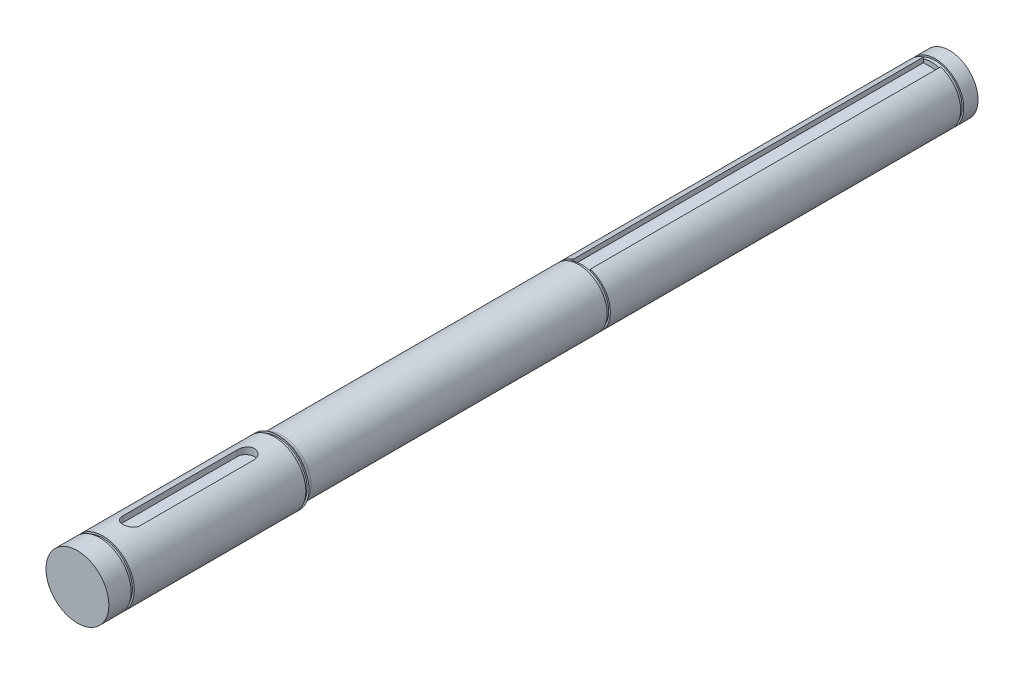
ISO-10303-21;
HEADER;
FILE_DESCRIPTION(('STEP AP214'),'2;1');
FILE_NAME('part.step','',(''),(''),'','','');
FILE_SCHEMA(('AUTOMOTIVE_DESIGN { 1 0 10303 214 1 1 1 1 }'));
ENDSEC;
DATA;
#1=APPLICATION_CONTEXT('core data for automotive mechanical design processes');
#2=APPLICATION_PROTOCOL_DEFINITION('international standard','automotive_design',2000,#1);
#3=PRODUCT_CONTEXT('',#1,'mechanical');
#4=PRODUCT('Part','Part','',(#3));
#5=PRODUCT_RELATED_PRODUCT_CATEGORY('part','',(#4));
#6=PRODUCT_DEFINITION_FORMATION('','',#4);
#7=PRODUCT_DEFINITION_CONTEXT('part definition',#1,'design');
#8=PRODUCT_DEFINITION('design','',#6,#7);
#9=PRODUCT_DEFINITION_SHAPE('','',#8);
#10=(LENGTH_UNIT() NAMED_UNIT(*) SI_UNIT(.MILLI.,.METRE.));
#11=(NAMED_UNIT(*) PLANE_ANGLE_UNIT() SI_UNIT($,.RADIAN.));
#12=(NAMED_UNIT(*) SI_UNIT($,.STERADIAN.) SOLID_ANGLE_UNIT());
#13=UNCERTAINTY_MEASURE_WITH_UNIT(LENGTH_MEASURE(1.E-05),#10,'distance_accuracy_value','');
#14=(GEOMETRIC_REPRESENTATION_CONTEXT(3) GLOBAL_UNCERTAINTY_ASSIGNED_CONTEXT((#13)) GLOBAL_UNIT_ASSIGNED_CONTEXT((#10,
#11,#12)) REPRESENTATION_CONTEXT('',''));
#15=CARTESIAN_POINT('',(0.,0.,0.));
#16=DIRECTION('',(0.,0.,1.));
#17=DIRECTION('',(1.,0.,0.));
#18=AXIS2_PLACEMENT_3D('',#15,#16,#17);
#19=CARTESIAN_POINT('',(0.,0.,235.));
#20=DIRECTION('',(0.,0.,-1.));
#21=DIRECTION('',(-1.,0.,0.));
#22=AXIS2_PLACEMENT_3D('',#19,#20,#21);
#23=CYLINDRICAL_SURFACE('',#22,10.);
#24=CARTESIAN_POINT('',(0.,0.,128.6));
#25=DIRECTION('',(0.,0.,-1.));
#26=DIRECTION('',(-1.,0.,0.));
#27=AXIS2_PLACEMENT_3D('',#24,#25,#26);
#28=CIRCLE('',#27,10.);
#29=CARTESIAN_POINT('',(3.,9.53939201416946,128.6));
#30=VERTEX_POINT('',#29);
#31=CARTESIAN_POINT('',(-3.,9.53939201416946,128.6));
#32=VERTEX_POINT('',#31);
#33=EDGE_CURVE('E204',#30,#32,#28,.T.);
#34=ORIENTED_EDGE('',*,*,#33,.T.);
#35=DIRECTION('',(0.,0.,-1.));
#36=VECTOR('',#35,1.);
#37=CARTESIAN_POINT('',(-3.,9.53939201416946,235.));
#38=LINE('',#37,#36);
#39=CARTESIAN_POINT('',(-3.,9.53939201416946,6.10000000000001));
#40=VERTEX_POINT('',#39);
#41=EDGE_CURVE('E194',#32,#40,#38,.T.);
#42=ORIENTED_EDGE('',*,*,#41,.T.);
#43=CARTESIAN_POINT('',(0.,0.,6.1));
#44=DIRECTION('',(0.,0.,-1.));
#45=DIRECTION('',(-1.,0.,0.));
#46=AXIS2_PLACEMENT_3D('',#43,#44,#45);
#47=CIRCLE('',#46,10.);
#48=CARTESIAN_POINT('',(3.,9.53939201416946,6.10000000000001));
#49=VERTEX_POINT('',#48);
#50=EDGE_CURVE('E217',#49,#40,#47,.T.);
#51=ORIENTED_EDGE('',*,*,#50,.F.);
#52=DIRECTION('',(0.,0.,-1.));
#53=VECTOR('',#52,1.);
#54=CARTESIAN_POINT('',(3.,9.53939201416946,235.));
#55=LINE('',#54,#53);
#56=EDGE_CURVE('E189',#49,#30,#55,.F.);
#57=ORIENTED_EDGE('',*,*,#56,.T.);
#58=EDGE_LOOP('',(#34,#42,#51,#57));
#59=FACE_BOUND('',#58,.T.);
#60=ADVANCED_FACE('F33',(#59),#23,.T.);
#61=CARTESIAN_POINT('',(0.,0.,6.1));
#62=DIRECTION('',(0.,0.,-1.));
#63=DIRECTION('',(-1.,0.,0.));
#64=AXIS2_PLACEMENT_3D('',#61,#62,#63);
#65=PLANE('',#64);
#66=DIRECTION('',(0.,1.,0.));
#67=VECTOR('',#66,1.);
#68=CARTESIAN_POINT('',(-3.,10.8777926354471,6.10000000000001));
#69=LINE('',#68,#67);
#70=CARTESIAN_POINT('',(-3.,8.94007270663947,6.10000000000001));
#71=VERTEX_POINT('',#70);
#72=EDGE_CURVE('E169',#71,#40,#69,.T.);
#73=ORIENTED_EDGE('',*,*,#72,.F.);
#74=CARTESIAN_POINT('',(0.,0.,6.1));
#75=DIRECTION('',(0.,0.,-1.));
#76=DIRECTION('',(-1.,0.,0.));
#77=AXIS2_PLACEMENT_3D('',#74,#75,#76);
#78=CIRCLE('',#77,9.43);
#79=CARTESIAN_POINT('',(3.,8.94007270663947,6.10000000000001));
#80=VERTEX_POINT('',#79);
#81=EDGE_CURVE('E214',#80,#71,#78,.T.);
#82=ORIENTED_EDGE('',*,*,#81,.F.);
#83=DIRECTION('',(0.,-1.,0.));
#84=VECTOR('',#83,1.);
#85=CARTESIAN_POINT('',(3.,7.81,6.10000000000001));
#86=LINE('',#85,#84);
#87=EDGE_CURVE('E183',#49,#80,#86,.T.);
#88=ORIENTED_EDGE('',*,*,#87,.F.);
#89=ORIENTED_EDGE('',*,*,#50,.T.);
#90=EDGE_LOOP('',(#73,#82,#88,#89));
#91=FACE_BOUND('',#90,.T.);
#92=ADVANCED_FACE('F290',(#91),#65,.T.);
#93=CARTESIAN_POINT('',(0.,0.,5.));
#94=DIRECTION('',(0.,0.,-1.));
#95=DIRECTION('',(-1.,0.,0.));
#96=AXIS2_PLACEMENT_3D('',#93,#94,#95);
#97=PLANE('',#96);
#98=CARTESIAN_POINT('',(0.,0.,5.));
#99=DIRECTION('',(0.,0.,-1.));
#100=DIRECTION('',(-1.,0.,0.));
#101=AXIS2_PLACEMENT_3D('',#98,#99,#100);
#102=CIRCLE('',#101,9.43);
#103=CARTESIAN_POINT('',(-9.43,0.,5.));
#104=VERTEX_POINT('',#103);
#105=EDGE_CURVE('E207',#104,#104,#102,.T.);
#106=ORIENTED_EDGE('',*,*,#105,.T.);
#107=EDGE_LOOP('',(#106));
#108=FACE_BOUND('',#107,.T.);
#109=CARTESIAN_POINT('',(0.,0.,5.));
#110=DIRECTION('',(0.,0.,-1.));
#111=DIRECTION('',(-1.,0.,0.));
#112=AXIS2_PLACEMENT_3D('',#109,#110,#111);
#113=CIRCLE('',#112,10.);
#114=CARTESIAN_POINT('',(-10.,0.,4.99999999999998));
#115=VERTEX_POINT('',#114);
#116=EDGE_CURVE('E213',#115,#115,#113,.T.);
#117=ORIENTED_EDGE('',*,*,#116,.F.);
#118=EDGE_LOOP('',(#117));
#119=FACE_BOUND('',#118,.T.);
#120=ADVANCED_FACE('F297',(#108,#119),#97,.F.);
#121=CARTESIAN_POINT('',(0.,0.,6.1));
#122=DIRECTION('',(0.,0.,-1.));
#123=DIRECTION('',(-1.,0.,0.));
#124=AXIS2_PLACEMENT_3D('',#121,#122,#123);
#125=CYLINDRICAL_SURFACE('',#124,9.43);
#126=EDGE_CURVE('E210',#71,#80,#78,.T.);
#127=ORIENTED_EDGE('',*,*,#126,.T.);
#128=ORIENTED_EDGE('',*,*,#81,.T.);
#129=EDGE_LOOP('',(#127,#128));
#130=FACE_BOUND('',#129,.T.);
#131=ORIENTED_EDGE('',*,*,#105,.F.);
#132=EDGE_LOOP('',(#131));
#133=FACE_BOUND('',#132,.T.);
#134=ADVANCED_FACE('F316',(#130,#133),#125,.T.);
#135=CARTESIAN_POINT('',(0.,0.,0.));
#136=DIRECTION('',(0.,0.,1.));
#137=DIRECTION('',(1.,0.,0.));
#138=AXIS2_PLACEMENT_3D('',#135,#136,#137);
#139=PLANE('',#138);
#140=CARTESIAN_POINT('',(0.,0.,0.));
#141=DIRECTION('',(0.,0.,1.));
#142=DIRECTION('',(1.,0.,0.));
#143=AXIS2_PLACEMENT_3D('',#140,#141,#142);
#144=CIRCLE('',#143,10.);
#145=CARTESIAN_POINT('',(-10.,0.,0.));
#146=VERTEX_POINT('',#145);
#147=EDGE_CURVE('E220',#146,#146,#144,.T.);
#148=ORIENTED_EDGE('',*,*,#147,.F.);
#149=EDGE_LOOP('',(#148));
#150=FACE_BOUND('',#149,.T.);
#151=ADVANCED_FACE('F307',(#150),#139,.F.);
#152=CARTESIAN_POINT('',(-10.,0.,4.99999999999998));
#153=CARTESIAN_POINT('',(-10.,0.,4.94791666666664));
#154=CARTESIAN_POINT('',(-10.,0.,4.89583333333331));
#155=CARTESIAN_POINT('',(-10.,0.,4.79166666666665));
#156=CARTESIAN_POINT('',(-10.,0.,4.73958333333332));
#157=CARTESIAN_POINT('',(-10.,0.,4.63541666666665));
#158=CARTESIAN_POINT('',(-10.,0.,4.58333333333332));
#159=CARTESIAN_POINT('',(-10.,0.,4.47916666666665));
#160=CARTESIAN_POINT('',(-10.,0.,4.42708333333332));
#161=CARTESIAN_POINT('',(-10.,0.,4.32291666666665));
#162=CARTESIAN_POINT('',(-10.,0.,4.27083333333331));
#163=CARTESIAN_POINT('',(-10.,0.,4.16666666666663));
#164=CARTESIAN_POINT('',(-10.,0.,4.1145833333333));
#165=CARTESIAN_POINT('',(-10.,0.,4.01041666666664));
#166=CARTESIAN_POINT('',(-10.,0.,3.9583333333333));
#167=CARTESIAN_POINT('',(-10.,0.,3.85416666666664));
#168=CARTESIAN_POINT('',(-10.,0.,3.80208333333331));
#169=CARTESIAN_POINT('',(-10.,0.,3.69791666666664));
#170=CARTESIAN_POINT('',(-10.,0.,3.64583333333331));
#171=CARTESIAN_POINT('',(-10.,0.,3.54166666666665));
#172=CARTESIAN_POINT('',(-10.,0.,3.48958333333331));
#173=CARTESIAN_POINT('',(-10.,0.,3.38541666666665));
#174=CARTESIAN_POINT('',(-10.,0.,3.33333333333332));
#175=CARTESIAN_POINT('',(-10.,0.,3.22916666666664));
#176=CARTESIAN_POINT('',(-10.,0.,3.1770833333333));
#177=CARTESIAN_POINT('',(-10.,0.,3.07291666666663));
#178=CARTESIAN_POINT('',(-10.,0.,3.0208333333333));
#179=CARTESIAN_POINT('',(-10.,0.,2.91666666666663));
#180=CARTESIAN_POINT('',(-10.,0.,2.8645833333333));
#181=CARTESIAN_POINT('',(-10.,0.,2.76041666666664));
#182=CARTESIAN_POINT('',(-10.,0.,2.7083333333333));
#183=CARTESIAN_POINT('',(-10.,0.,2.60416666666664));
#184=CARTESIAN_POINT('',(-10.,0.,2.55208333333331));
#185=CARTESIAN_POINT('',(-10.,0.,2.44791666666664));
#186=CARTESIAN_POINT('',(-10.,0.,2.39583333333331));
#187=CARTESIAN_POINT('',(-10.,0.,2.29166666666665));
#188=CARTESIAN_POINT('',(-10.,0.,2.23958333333331));
#189=CARTESIAN_POINT('',(-10.,0.,2.13541666666665));
#190=CARTESIAN_POINT('',(-10.,0.,2.08333333333332));
#191=CARTESIAN_POINT('',(-10.,0.,1.97916666666665));
#192=CARTESIAN_POINT('',(-10.,0.,1.92708333333332));
#193=CARTESIAN_POINT('',(-10.,0.,1.82291666666665));
#194=CARTESIAN_POINT('',(-10.,0.,1.7708333333333));
#195=CARTESIAN_POINT('',(-10.,0.,1.66666666666663));
#196=CARTESIAN_POINT('',(-10.,0.,1.6145833333333));
#197=CARTESIAN_POINT('',(-10.,0.,1.51041666666663));
#198=CARTESIAN_POINT('',(-10.,0.,1.4583333333333));
#199=CARTESIAN_POINT('',(-10.,0.,1.35416666666664));
#200=CARTESIAN_POINT('',(-10.,0.,1.30208333333331));
#201=CARTESIAN_POINT('',(-10.,0.,1.19791666666664));
#202=CARTESIAN_POINT('',(-10.,0.,1.14583333333331));
#203=CARTESIAN_POINT('',(-10.,0.,1.04166666666664));
#204=CARTESIAN_POINT('',(-10.,0.,0.989583333333312));
#205=CARTESIAN_POINT('',(-10.,0.,0.885416666666648));
#206=CARTESIAN_POINT('',(-10.,0.,0.833333333333316));
#207=CARTESIAN_POINT('',(-10.,0.,0.729166666666642));
#208=CARTESIAN_POINT('',(-10.,0.,0.6770833333333));
#209=CARTESIAN_POINT('',(-10.,0.,0.572916666666627));
#210=CARTESIAN_POINT('',(-10.,0.,0.520833333333295));
#211=CARTESIAN_POINT('',(-10.,0.,0.41666666666663));
#212=CARTESIAN_POINT('',(-10.,0.,0.364583333333298));
#213=CARTESIAN_POINT('',(-10.,0.,0.260416666666633));
#214=CARTESIAN_POINT('',(-10.,0.,0.208333333333301));
#215=CARTESIAN_POINT('',(-10.,0.,0.104166666666637));
#216=CARTESIAN_POINT('',(-10.,0.,0.0520833333333045));
#217=CARTESIAN_POINT('',(-10.,0.,0.));
#218=B_SPLINE_CURVE_WITH_KNOTS('',3,(#152,#153,#154,#155,#156,#157,#158,#159,#160,#161,#162,
#163,#164,#165,#166,#167,#168,#169,#170,#171,#172,#173,#174,#175,#176,#177,#178,#179,#180,#181,
#182,#183,#184,#185,#186,#187,#188,#189,#190,#191,#192,#193,#194,#195,#196,#197,#198,#199,#200,
#201,#202,#203,#204,#205,#206,#207,#208,#209,#210,#211,#212,#213,#214,#215,#216,#217),
.UNSPECIFIED.,.F.,.F.,(4,2,2,2,2,2,2,2,2,2,2,2,2,2,2,2,2,2,2,2,2,2,2,2,2,2,2,2,2,2,2,2,4),(0.,
0.156249999999997,0.312499999999993,0.46874999999999,0.624999999999987,0.781250000000011,
0.937500000000008,1.09375,1.25,1.40625,1.56249999999999,1.71874999999999,1.87500000000002,
2.03125000000001,2.18750000000001,2.34375000000001,2.5,2.65625,2.8125,2.96874999999999,
3.12499999999999,3.28125000000001,3.43750000000001,3.59375000000001,3.75,3.90625,4.0625,
4.21874999999999,4.37500000000002,4.53125000000001,4.68750000000001,4.84375000000001,5.),.UNSPECIFIED.);
#219=EDGE_CURVE('BSEAM293',#115,#146,#218,.T.);
#220=ORIENTED_EDGE('',*,*,#116,.T.);
#221=ORIENTED_EDGE('',*,*,#147,.T.);
#222=ORIENTED_EDGE('',*,*,#219,.T.);
#223=ORIENTED_EDGE('',*,*,#219,.F.);
#224=EDGE_LOOP('',(#220,#222,#221,#223));
#225=FACE_BOUND('',#224,.T.);
#226=ADVANCED_FACE('F293',(#225),#23,.T.);
#227=CARTESIAN_POINT('',(0.,0.,128.6));
#228=DIRECTION('',(0.,0.,1.));
#229=DIRECTION('',(-1.,0.,0.));
#230=AXIS2_PLACEMENT_3D('',#227,#228,#229);
#231=PLANE('',#230);
#232=DIRECTION('',(0.,1.,0.));
#233=VECTOR('',#232,1.);
#234=CARTESIAN_POINT('',(-3.,10.8777926354471,128.6));
#235=LINE('',#234,#233);
#236=CARTESIAN_POINT('',(-3.,8.94007270663947,128.6));
#237=VERTEX_POINT('',#236);
#238=EDGE_CURVE('E172',#237,#32,#235,.T.);
#239=ORIENTED_EDGE('',*,*,#238,.T.);
#240=ORIENTED_EDGE('',*,*,#33,.F.);
#241=DIRECTION('',(0.,-1.,0.));
#242=VECTOR('',#241,1.);
#243=CARTESIAN_POINT('',(3.,7.81,128.6));
#244=LINE('',#243,#242);
#245=CARTESIAN_POINT('',(3.,8.94007270663947,128.6));
#246=VERTEX_POINT('',#245);
#247=EDGE_CURVE('E174',#30,#246,#244,.T.);
#248=ORIENTED_EDGE('',*,*,#247,.T.);
#249=CARTESIAN_POINT('',(0.,0.,128.6));
#250=DIRECTION('',(0.,0.,-1.));
#251=DIRECTION('',(-1.,0.,0.));
#252=AXIS2_PLACEMENT_3D('',#249,#250,#251);
#253=CIRCLE('',#252,9.43);
#254=EDGE_CURVE('E201',#246,#237,#253,.T.);
#255=ORIENTED_EDGE('',*,*,#254,.T.);
#256=EDGE_LOOP('',(#239,#240,#248,#255));
#257=FACE_BOUND('',#256,.T.);
#258=ADVANCED_FACE('F306',(#257),#231,.T.);
#259=CARTESIAN_POINT('',(0.,0.,129.7));
#260=DIRECTION('',(0.,0.,1.));
#261=DIRECTION('',(-1.,0.,0.));
#262=AXIS2_PLACEMENT_3D('',#259,#260,#261);
#263=PLANE('',#262);
#264=CARTESIAN_POINT('',(0.,0.,129.7));
#265=DIRECTION('',(0.,0.,-1.));
#266=DIRECTION('',(-1.,0.,0.));
#267=AXIS2_PLACEMENT_3D('',#264,#265,#266);
#268=CIRCLE('',#267,10.);
#269=CARTESIAN_POINT('',(-10.,0.,129.7));
#270=VERTEX_POINT('',#269);
#271=EDGE_CURVE('E200',#270,#270,#268,.T.);
#272=ORIENTED_EDGE('',*,*,#271,.T.);
#273=EDGE_LOOP('',(#272));
#274=FACE_BOUND('',#273,.T.);
#275=CARTESIAN_POINT('',(0.,0.,129.7));
#276=DIRECTION('',(0.,0.,-1.));
#277=DIRECTION('',(-1.,0.,0.));
#278=AXIS2_PLACEMENT_3D('',#275,#276,#277);
#279=CIRCLE('',#278,9.43);
#280=CARTESIAN_POINT('',(-9.43,0.,129.7));
#281=VERTEX_POINT('',#280);
#282=EDGE_CURVE('E197',#281,#281,#279,.T.);
#283=ORIENTED_EDGE('',*,*,#282,.F.);
#284=EDGE_LOOP('',(#283));
#285=FACE_BOUND('',#284,.T.);
#286=ADVANCED_FACE('F313',(#274,#285),#263,.F.);
#287=CARTESIAN_POINT('',(0.,0.,128.6));
#288=DIRECTION('',(0.,0.,1.));
#289=DIRECTION('',(1.,0.,0.));
#290=AXIS2_PLACEMENT_3D('',#287,#288,#289);
#291=CYLINDRICAL_SURFACE('',#290,9.43);
#292=EDGE_CURVE('E198',#237,#246,#253,.T.);
#293=ORIENTED_EDGE('',*,*,#292,.F.);
#294=ORIENTED_EDGE('',*,*,#254,.F.);
#295=EDGE_LOOP('',(#293,#294));
#296=FACE_BOUND('',#295,.T.);
#297=ORIENTED_EDGE('',*,*,#282,.T.);
#298=EDGE_LOOP('',(#297));
#299=FACE_BOUND('',#298,.T.);
#300=ADVANCED_FACE('F303',(#296,#299),#291,.T.);
#301=CARTESIAN_POINT('',(0.,0.,233.267949192431));
#302=DIRECTION('',(0.,0.,1.));
#303=DIRECTION('',(1.,0.,0.));
#304=AXIS2_PLACEMENT_3D('',#301,#302,#303);
#305=CIRCLE('',#304,10.);
#306=CARTESIAN_POINT('',(-10.,0.,233.267949192431));
#307=VERTEX_POINT('',#306);
#308=EDGE_CURVE('E225',#307,#307,#305,.F.);
#309=CARTESIAN_POINT('',(-10.,0.,233.267949192431));
#310=CARTESIAN_POINT('',(-10.,0.,232.189116388343));
#311=CARTESIAN_POINT('',(-10.,0.,231.110283584255));
#312=CARTESIAN_POINT('',(-10.,0.,228.95261797608));
#313=CARTESIAN_POINT('',(-10.,0.,227.873785171992));
#314=CARTESIAN_POINT('',(-10.,0.,225.716119563816));
#315=CARTESIAN_POINT('',(-10.,0.,224.637286759728));
#316=CARTESIAN_POINT('',(-10.,0.,222.479621151553));
#317=CARTESIAN_POINT('',(-10.,0.,221.400788347465));
#318=CARTESIAN_POINT('',(-10.,0.,219.243122739289));
#319=CARTESIAN_POINT('',(-10.,0.,218.164289935202));
#320=CARTESIAN_POINT('',(-10.,0.,216.006624327026));
#321=CARTESIAN_POINT('',(-10.,0.,214.927791522938));
#322=CARTESIAN_POINT('',(-10.,0.,212.770125914762));
#323=CARTESIAN_POINT('',(-10.,0.,211.691293110675));
#324=CARTESIAN_POINT('',(-10.,0.,209.533627502499));
#325=CARTESIAN_POINT('',(-10.,0.,208.454794698411));
#326=CARTESIAN_POINT('',(-10.,0.,206.297129090236));
#327=CARTESIAN_POINT('',(-10.,0.,205.218296286148));
#328=CARTESIAN_POINT('',(-10.,0.,203.060630677972));
#329=CARTESIAN_POINT('',(-10.,0.,201.981797873884));
#330=CARTESIAN_POINT('',(-10.,0.,199.824132265709));
#331=CARTESIAN_POINT('',(-10.,0.,198.745299461621));
#332=CARTESIAN_POINT('',(-10.,0.,196.587633853445));
#333=CARTESIAN_POINT('',(-10.,0.,195.508801049357));
#334=CARTESIAN_POINT('',(-10.,0.,193.351135441182));
#335=CARTESIAN_POINT('',(-10.,0.,192.272302637094));
#336=CARTESIAN_POINT('',(-10.,0.,190.114637028918));
#337=CARTESIAN_POINT('',(-10.,0.,189.03580422483));
#338=CARTESIAN_POINT('',(-10.,0.,186.878138616655));
#339=CARTESIAN_POINT('',(-10.,0.,185.799305812567));
#340=CARTESIAN_POINT('',(-10.,0.,183.641640204391));
#341=CARTESIAN_POINT('',(-10.,0.,182.562807400303));
#342=CARTESIAN_POINT('',(-10.,0.,180.405141792128));
#343=CARTESIAN_POINT('',(-10.,0.,179.32630898804));
#344=CARTESIAN_POINT('',(-10.,0.,177.168643379864));
#345=CARTESIAN_POINT('',(-10.,0.,176.089810575776));
#346=CARTESIAN_POINT('',(-10.,0.,173.932144967601));
#347=CARTESIAN_POINT('',(-10.,0.,172.853312163513));
#348=CARTESIAN_POINT('',(-10.,0.,170.695646555337));
#349=CARTESIAN_POINT('',(-10.,0.,169.616813751249));
#350=CARTESIAN_POINT('',(-10.,0.,167.459148143074));
#351=CARTESIAN_POINT('',(-10.,0.,166.380315338986));
#352=CARTESIAN_POINT('',(-10.,0.,164.22264973081));
#353=CARTESIAN_POINT('',(-10.,0.,163.143816926723));
#354=CARTESIAN_POINT('',(-10.,0.,160.986151318547));
#355=CARTESIAN_POINT('',(-10.,0.,159.907318514459));
#356=CARTESIAN_POINT('',(-10.,0.,157.749652906283));
#357=CARTESIAN_POINT('',(-10.,0.,156.670820102196));
#358=CARTESIAN_POINT('',(-10.,0.,154.51315449402));
#359=CARTESIAN_POINT('',(-10.,0.,153.434321689932));
#360=CARTESIAN_POINT('',(-10.,0.,151.276656081756));
#361=CARTESIAN_POINT('',(-10.,0.,150.197823277669));
#362=CARTESIAN_POINT('',(-10.,0.,148.040157669493));
#363=CARTESIAN_POINT('',(-10.,0.,146.961324865405));
#364=CARTESIAN_POINT('',(-10.,0.,144.80365925723));
#365=CARTESIAN_POINT('',(-10.,0.,143.724826453142));
#366=CARTESIAN_POINT('',(-10.,0.,141.567160844966));
#367=CARTESIAN_POINT('',(-10.,0.,140.488328040878));
#368=CARTESIAN_POINT('',(-10.,0.,138.330662432703));
#369=CARTESIAN_POINT('',(-10.,0.,137.251829628615));
#370=CARTESIAN_POINT('',(-10.,0.,135.094164020439));
#371=CARTESIAN_POINT('',(-10.,0.,134.015331216351));
#372=CARTESIAN_POINT('',(-10.,0.,131.857665608176));
#373=CARTESIAN_POINT('',(-10.,0.,130.778832804088));
#374=CARTESIAN_POINT('',(-10.,0.,129.7));
#375=B_SPLINE_CURVE_WITH_KNOTS('',3,(#309,#310,#311,#312,#313,#314,#315,#316,#317,#318,#319,
#320,#321,#322,#323,#324,#325,#326,#327,#328,#329,#330,#331,#332,#333,#334,#335,#336,#337,#338,
#339,#340,#341,#342,#343,#344,#345,#346,#347,#348,#349,#350,#351,#352,#353,#354,#355,#356,#357,
#358,#359,#360,#361,#362,#363,#364,#365,#366,#367,#368,#369,#370,#371,#372,#373,#374),
.UNSPECIFIED.,.F.,.F.,(4,2,2,2,2,2,2,2,2,2,2,2,2,2,2,2,2,2,2,2,2,2,2,2,2,2,2,2,2,2,2,2,4),(0.,
3.23649841226345,6.47299682452693,9.7094952367904,12.9459936490539,16.1824920613173,
19.4189904735808,22.6554888858443,25.8919872981077,29.1284857103712,32.3649841226347,
35.6014825348982,38.8379809471616,42.0744793594251,45.3109777716886,48.5474761839521,
51.7839745962155,55.020473008479,58.2569714207425,61.4934698330059,64.7299682452694,
67.9664666575329,71.2029650697963,74.4394634820598,77.6759618943233,80.9124603065868,
84.1489587188502,87.3854571311137,90.6219555433772,93.8584539556406,97.0949523679041,
100.331450780168,103.567949192431),.UNSPECIFIED.);
#376=EDGE_CURVE('BSEAM292',#307,#270,#375,.T.);
#377=ORIENTED_EDGE('',*,*,#308,.T.);
#378=ORIENTED_EDGE('',*,*,#271,.F.);
#379=ORIENTED_EDGE('',*,*,#376,.T.);
#380=ORIENTED_EDGE('',*,*,#376,.F.);
#381=EDGE_LOOP('',(#377,#379,#378,#380));
#382=FACE_BOUND('',#381,.T.);
#383=ADVANCED_FACE('F292',(#382),#23,.T.);
#384=CARTESIAN_POINT('',(-3.,10.8777926354471,128.6));
#385=DIRECTION('',(-1.,0.,0.));
#386=DIRECTION('',(0.,0.,1.));
#387=AXIS2_PLACEMENT_3D('',#384,#385,#386);
#388=PLANE('',#387);
#389=ORIENTED_EDGE('',*,*,#238,.F.);
#390=CARTESIAN_POINT('',(-3.,7.81,128.6));
#391=VERTEX_POINT('',#390);
#392=EDGE_CURVE('E56',#391,#237,#235,.T.);
#393=ORIENTED_EDGE('',*,*,#392,.F.);
#394=DIRECTION('',(0.,0.,-1.));
#395=VECTOR('',#394,1.);
#396=CARTESIAN_POINT('',(-3.,7.81,128.6));
#397=LINE('',#396,#395);
#398=CARTESIAN_POINT('',(-3.,7.81,6.10000000000001));
#399=VERTEX_POINT('',#398);
#400=EDGE_CURVE('E187',#391,#399,#397,.T.);
#401=ORIENTED_EDGE('',*,*,#400,.T.);
#402=EDGE_CURVE('E178',#399,#71,#69,.T.);
#403=ORIENTED_EDGE('',*,*,#402,.T.);
#404=ORIENTED_EDGE('',*,*,#72,.T.);
#405=ORIENTED_EDGE('',*,*,#41,.F.);
#406=EDGE_LOOP('',(#389,#393,#401,#403,#404,#405));
#407=FACE_BOUND('',#406,.T.);
#408=ADVANCED_FACE('F302',(#407),#388,.F.);
#409=CARTESIAN_POINT('',(3.,7.81,128.6));
#410=DIRECTION('',(1.,0.,0.));
#411=DIRECTION('',(0.,0.,-1.));
#412=AXIS2_PLACEMENT_3D('',#409,#410,#411);
#413=PLANE('',#412);
#414=ORIENTED_EDGE('',*,*,#87,.T.);
#415=CARTESIAN_POINT('',(3.,7.81,6.10000000000001));
#416=VERTEX_POINT('',#415);
#417=EDGE_CURVE('E181',#80,#416,#86,.T.);
#418=ORIENTED_EDGE('',*,*,#417,.T.);
#419=DIRECTION('',(0.,0.,-1.));
#420=VECTOR('',#419,1.);
#421=CARTESIAN_POINT('',(3.,7.81,128.6));
#422=LINE('',#421,#420);
#423=CARTESIAN_POINT('',(3.,7.81,128.6));
#424=VERTEX_POINT('',#423);
#425=EDGE_CURVE('E177',#424,#416,#422,.T.);
#426=ORIENTED_EDGE('',*,*,#425,.F.);
#427=EDGE_CURVE('E171',#246,#424,#244,.T.);
#428=ORIENTED_EDGE('',*,*,#427,.F.);
#429=ORIENTED_EDGE('',*,*,#247,.F.);
#430=ORIENTED_EDGE('',*,*,#56,.F.);
#431=EDGE_LOOP('',(#414,#418,#426,#428,#429,#430));
#432=FACE_BOUND('',#431,.T.);
#433=ADVANCED_FACE('F339',(#432),#413,.F.);
#434=CARTESIAN_POINT('',(0.,0.,128.6));
#435=DIRECTION('',(0.,0.,-1.));
#436=DIRECTION('',(-1.,0.,0.));
#437=AXIS2_PLACEMENT_3D('',#434,#435,#436);
#438=PLANE('',#437);
#439=ORIENTED_EDGE('',*,*,#292,.T.);
#440=ORIENTED_EDGE('',*,*,#427,.T.);
#441=DIRECTION('',(-1.,0.,0.));
#442=VECTOR('',#441,1.);
#443=CARTESIAN_POINT('',(3.,7.81,128.6));
#444=LINE('',#443,#442);
#445=EDGE_CURVE('E175',#424,#391,#444,.T.);
#446=ORIENTED_EDGE('',*,*,#445,.T.);
#447=ORIENTED_EDGE('',*,*,#392,.T.);
#448=EDGE_LOOP('',(#439,#440,#446,#447));
#449=FACE_BOUND('',#448,.T.);
#450=ADVANCED_FACE('F343',(#449),#438,.T.);
#451=CARTESIAN_POINT('',(3.,7.81,128.6));
#452=DIRECTION('',(0.,-1.,0.));
#453=DIRECTION('',(1.,0.,0.));
#454=AXIS2_PLACEMENT_3D('',#451,#452,#453);
#455=PLANE('',#454);
#456=DIRECTION('',(-1.,0.,0.));
#457=VECTOR('',#456,1.);
#458=CARTESIAN_POINT('',(3.,7.81,6.10000000000001));
#459=LINE('',#458,#457);
#460=EDGE_CURVE('E184',#416,#399,#459,.T.);
#461=ORIENTED_EDGE('',*,*,#460,.T.);
#462=ORIENTED_EDGE('',*,*,#400,.F.);
#463=ORIENTED_EDGE('',*,*,#445,.F.);
#464=ORIENTED_EDGE('',*,*,#425,.T.);
#465=EDGE_LOOP('',(#461,#462,#463,#464));
#466=FACE_BOUND('',#465,.T.);
#467=ADVANCED_FACE('F345',(#466),#455,.F.);
#468=CARTESIAN_POINT('',(0.,0.,6.10000000000001));
#469=DIRECTION('',(0.,0.,-1.));
#470=DIRECTION('',(-1.,0.,0.));
#471=AXIS2_PLACEMENT_3D('',#468,#469,#470);
#472=PLANE('',#471);
#473=ORIENTED_EDGE('',*,*,#126,.F.);
#474=ORIENTED_EDGE('',*,*,#402,.F.);
#475=ORIENTED_EDGE('',*,*,#460,.F.);
#476=ORIENTED_EDGE('',*,*,#417,.F.);
#477=EDGE_LOOP('',(#473,#474,#475,#476));
#478=FACE_BOUND('',#477,.T.);
#479=ADVANCED_FACE('F348',(#478),#472,.F.);
#480=CARTESIAN_POINT('',(0.,0.,233.267949192431));
#481=DIRECTION('',(0.,0.,1.));
#482=DIRECTION('',(1.,0.,0.));
#483=AXIS2_PLACEMENT_3D('',#480,#481,#482);
#484=TOROIDAL_SURFACE('',#483,12.,2.);
#485=ORIENTED_EDGE('',*,*,#308,.F.);
#486=EDGE_LOOP('',(#485));
#487=FACE_BOUND('',#486,.T.);
#488=CARTESIAN_POINT('',(0.,0.,235.));
#489=DIRECTION('',(0.,0.,1.));
#490=DIRECTION('',(1.,0.,0.));
#491=AXIS2_PLACEMENT_3D('',#488,#489,#490);
#492=CIRCLE('',#491,11.);
#493=CARTESIAN_POINT('',(11.,0.,235.));
#494=VERTEX_POINT('',#493);
#495=EDGE_CURVE('E158',#494,#494,#492,.T.);
#496=ORIENTED_EDGE('',*,*,#495,.F.);
#497=EDGE_LOOP('',(#496));
#498=FACE_BOUND('',#497,.T.);
#499=ADVANCED_FACE('F35',(#487,#498),#484,.F.);
#500=CARTESIAN_POINT('',(0.,0.,236.1));
#501=DIRECTION('',(0.,0.,1.));
#502=DIRECTION('',(1.,0.,0.));
#503=AXIS2_PLACEMENT_3D('',#500,#501,#502);
#504=PLANE('',#503);
#505=CARTESIAN_POINT('',(0.,0.,236.1));
#506=DIRECTION('',(0.,0.,1.));
#507=DIRECTION('',(1.,0.,0.));
#508=AXIS2_PLACEMENT_3D('',#505,#506,#507);
#509=CIRCLE('',#508,11.);
#510=CARTESIAN_POINT('',(11.,0.,236.1));
#511=VERTEX_POINT('',#510);
#512=EDGE_CURVE('E161',#511,#511,#509,.T.);
#513=ORIENTED_EDGE('',*,*,#512,.F.);
#514=EDGE_LOOP('',(#513));
#515=FACE_BOUND('',#514,.T.);
#516=CARTESIAN_POINT('',(0.,0.,236.1));
#517=DIRECTION('',(0.,0.,1.));
#518=DIRECTION('',(1.,0.,0.));
#519=AXIS2_PLACEMENT_3D('',#516,#517,#518);
#520=CIRCLE('',#519,10.35);
#521=CARTESIAN_POINT('',(10.35,0.,236.1));
#522=VERTEX_POINT('',#521);
#523=EDGE_CURVE('E155',#522,#522,#520,.T.);
#524=ORIENTED_EDGE('',*,*,#523,.T.);
#525=EDGE_LOOP('',(#524));
#526=FACE_BOUND('',#525,.T.);
#527=ADVANCED_FACE('F277',(#515,#526),#504,.F.);
#528=CARTESIAN_POINT('',(0.,0.,235.));
#529=DIRECTION('',(0.,0.,1.));
#530=DIRECTION('',(1.,0.,0.));
#531=AXIS2_PLACEMENT_3D('',#528,#529,#530);
#532=PLANE('',#531);
#533=ORIENTED_EDGE('',*,*,#495,.T.);
#534=EDGE_LOOP('',(#533));
#535=FACE_BOUND('',#534,.T.);
#536=CARTESIAN_POINT('',(0.,0.,235.));
#537=DIRECTION('',(0.,0.,1.));
#538=DIRECTION('',(1.,0.,0.));
#539=AXIS2_PLACEMENT_3D('',#536,#537,#538);
#540=CIRCLE('',#539,10.35);
#541=CARTESIAN_POINT('',(10.35,0.,235.));
#542=VERTEX_POINT('',#541);
#543=EDGE_CURVE('E152',#542,#542,#540,.T.);
#544=ORIENTED_EDGE('',*,*,#543,.F.);
#545=EDGE_LOOP('',(#544));
#546=FACE_BOUND('',#545,.T.);
#547=ADVANCED_FACE('F275',(#535,#546),#532,.T.);
#548=CARTESIAN_POINT('',(0.,0.,236.1));
#549=DIRECTION('',(0.,0.,-1.));
#550=DIRECTION('',(-1.,0.,0.));
#551=AXIS2_PLACEMENT_3D('',#548,#549,#550);
#552=CYLINDRICAL_SURFACE('',#551,10.35);
#553=ORIENTED_EDGE('',*,*,#523,.F.);
#554=EDGE_LOOP('',(#553));
#555=FACE_BOUND('',#554,.T.);
#556=ORIENTED_EDGE('',*,*,#543,.T.);
#557=EDGE_LOOP('',(#556));
#558=FACE_BOUND('',#557,.T.);
#559=ADVANCED_FACE('F272',(#555,#558),#552,.T.);
#560=CARTESIAN_POINT('',(0.,0.,305.));
#561=DIRECTION('',(0.,0.,-1.));
#562=DIRECTION('',(-1.,0.,0.));
#563=AXIS2_PLACEMENT_3D('',#560,#561,#562);
#564=CYLINDRICAL_SURFACE('',#563,11.);
#565=DIRECTION('',(0.,0.,-1.));
#566=VECTOR('',#565,1.);
#567=CARTESIAN_POINT('',(3.00000000000002,10.5830052442584,305.));
#568=LINE('',#567,#566);
#569=CARTESIAN_POINT('',(3.00000000000001,10.5830052442584,246.1));
#570=VERTEX_POINT('',#569);
#571=CARTESIAN_POINT('',(3.00000000000002,10.5830052442584,286.1));
#572=VERTEX_POINT('',#571);
#573=EDGE_CURVE('E11',#570,#572,#568,.F.);
#574=ORIENTED_EDGE('',*,*,#573,.T.);
#575=CARTESIAN_POINT('',(3.00000000000002,10.5830052442584,286.1));
#576=CARTESIAN_POINT('',(3.00000989976811,10.5829949970026,286.18269389141));
#577=CARTESIAN_POINT('',(2.99658102723596,10.5839742471726,286.265381704592));
#578=CARTESIAN_POINT('',(2.98292268314842,10.5878356752194,286.430133566229));
#579=CARTESIAN_POINT('',(2.97269452008915,10.5907174869552,286.512197731629));
#580=CARTESIAN_POINT('',(2.94554459027323,10.5982996181419,286.674942512145));
#581=CARTESIAN_POINT('',(2.92863770126912,10.6029958951229,286.755625789386));
#582=CARTESIAN_POINT('',(2.88829120712691,10.6140571066224,286.915203254054));
#583=CARTESIAN_POINT('',(2.86485147768951,10.6204220728906,286.994097407408));
#584=CARTESIAN_POINT('',(2.78500332821794,10.6417494872311,287.227242907164));
#585=CARTESIAN_POINT('',(2.71903526586308,10.6589535681767,287.378139394855));
#586=CARTESIAN_POINT('',(2.56365897700127,10.6973836998985,287.666705341769));
#587=CARTESIAN_POINT('',(2.47424245636573,10.7186111730805,287.804370097104));
#588=CARTESIAN_POINT('',(2.27200424315807,10.7633148792343,288.066209705978));
#589=CARTESIAN_POINT('',(2.15868225262837,10.7868322128172,288.189991878244));
#590=CARTESIAN_POINT('',(1.91292298422355,10.8331129950831,288.417051438905));
#591=CARTESIAN_POINT('',(1.78048258944453,10.8558763200935,288.520325477293));
#592=CARTESIAN_POINT('',(1.49749198480953,10.8985459264206,288.705098906746));
#593=CARTESIAN_POINT('',(1.34667477161626,10.9183977479742,288.786203079821));
#594=CARTESIAN_POINT('',(1.03291980522389,10.9525311229674,288.92174841378));
#595=CARTESIAN_POINT('',(0.869984764533427,10.9668139185607,288.976195521132));
#596=CARTESIAN_POINT('',(0.540744675896749,10.9879090070619,289.055601734903));
#597=CARTESIAN_POINT('',(0.374613167612567,10.9948916417093,289.081234326369));
#598=CARTESIAN_POINT('',(0.0402673813620529,11.0011960589752,289.104404664847));
#599=CARTESIAN_POINT('',(-0.127946573564664,11.0005190152883,289.101946716178));
#600=CARTESIAN_POINT('',(-0.456980924404225,10.9917041066205,289.069475124185));
#601=CARTESIAN_POINT('',(-0.617879308918055,10.9837634920705,289.040189973227));
#602=CARTESIAN_POINT('',(-0.932383527853118,10.9615477415639,288.956074784141));
#603=CARTESIAN_POINT('',(-1.08598900853896,10.9472722986892,288.901243508315));
#604=CARTESIAN_POINT('',(-1.38338788045075,10.9137016176963,288.767045133193));
#605=CARTESIAN_POINT('',(-1.52706425574143,10.8943563157114,288.687431753761));
#606=CARTESIAN_POINT('',(-1.79926098198641,10.8527253375081,288.506120130093));
#607=CARTESIAN_POINT('',(-1.92777854091952,10.830439121215,288.404417827188));
#608=CARTESIAN_POINT('',(-2.17034844112026,10.7844948742978,288.177976764916));
#609=CARTESIAN_POINT('',(-2.28380693028887,10.760815765188,288.052605446131));
#610=CARTESIAN_POINT('',(-2.48826234185504,10.7153886222241,287.78433761913));
#611=CARTESIAN_POINT('',(-2.5792530098078,10.6936411271564,287.641436247546));
#612=CARTESIAN_POINT('',(-2.7366791061542,10.6544469945807,287.340805187246));
#613=CARTESIAN_POINT('',(-2.80293223890784,10.6370325899538,287.182975757243));
#614=CARTESIAN_POINT('',(-2.90768324325778,10.6088816209578,286.857912905473));
#615=CARTESIAN_POINT('',(-2.94622291362357,10.598135003286,286.690694057725));
#616=CARTESIAN_POINT('',(-2.98015870664205,10.588613232355,286.451645560133));
#617=CARTESIAN_POINT('',(-2.98759962141259,10.5865140551644,286.381483540276));
#618=CARTESIAN_POINT('',(-2.9975151286322,10.58371035186,286.24089244676));
#619=CARTESIAN_POINT('',(-2.99999749605755,10.5830036423878,286.170463964942));
#620=CARTESIAN_POINT('',(-2.99999999999998,10.5830052442584,286.1));
#621=B_SPLINE_CURVE_WITH_KNOTS('',3,(#575,#576,#577,#578,#579,#580,#581,#582,#583,#584,#585,
#586,#587,#588,#589,#590,#591,#592,#593,#594,#595,#596,#597,#598,#599,#600,#601,#602,#603,#604,
#605,#606,#607,#608,#609,#610,#611,#612,#613,#614,#615,#616,#617,#618,#619,#620),.UNSPECIFIED.,
.F.,.F.,(4,2,2,2,2,2,2,2,2,2,2,2,2,2,2,2,2,2,2,2,2,2,4),(0.,0.247994395628727,0.495941079544131,
0.743338515979091,0.99074065992621,1.48499724217188,1.97942888795731,2.48547083856631,
2.9915953833713,3.50622794981866,4.02074566333957,4.52296979924471,5.02511698025348,
5.51402000992993,6.00294672920888,6.49689640600088,6.99093691914144,7.50077286033219,
8.01075056671344,8.52441550873712,9.03730408243459,9.24891043373576,9.46018472611213),.UNSPECIFIED.);
#622=CARTESIAN_POINT('',(-2.99999999999998,10.5830052442584,286.1));
#623=VERTEX_POINT('',#622);
#624=EDGE_CURVE('E228',#572,#623,#621,.T.);
#625=ORIENTED_EDGE('',*,*,#624,.T.);
#626=DIRECTION('',(0.,0.,-1.));
#627=VECTOR('',#626,1.);
#628=CARTESIAN_POINT('',(-2.99999999999998,10.5830052442584,305.));
#629=LINE('',#628,#627);
#630=CARTESIAN_POINT('',(-2.99999999999998,10.5830052442584,246.1));
#631=VERTEX_POINT('',#630);
#632=EDGE_CURVE('E41',#623,#631,#629,.T.);
#633=ORIENTED_EDGE('',*,*,#632,.T.);
#634=CARTESIAN_POINT('',(-2.99999999999999,10.5830052442584,246.1));
#635=CARTESIAN_POINT('',(-3.00000989976807,10.5829949970026,246.01730610859));
#636=CARTESIAN_POINT('',(-2.99658102723593,10.5839742471726,245.934618295408));
#637=CARTESIAN_POINT('',(-2.98292268314839,10.5878356752194,245.769866433771));
#638=CARTESIAN_POINT('',(-2.97269452008912,10.5907174869552,245.687802268371));
#639=CARTESIAN_POINT('',(-2.94554459027319,10.598299618142,245.525057487855));
#640=CARTESIAN_POINT('',(-2.92863770126908,10.6029958951229,245.444374210614));
#641=CARTESIAN_POINT('',(-2.88829120712687,10.6140571066224,245.284796745946));
#642=CARTESIAN_POINT('',(-2.86485147768948,10.6204220728906,245.205902592592));
#643=CARTESIAN_POINT('',(-2.78500332821792,10.6417494872311,244.972757092836));
#644=CARTESIAN_POINT('',(-2.71903526586305,10.6589535681767,244.821860605145));
#645=CARTESIAN_POINT('',(-2.56365897700123,10.6973836998985,244.533294658231));
#646=CARTESIAN_POINT('',(-2.47424245636569,10.7186111730806,244.395629902896));
#647=CARTESIAN_POINT('',(-2.27200424315804,10.7633148792344,244.133790294021));
#648=CARTESIAN_POINT('',(-2.15868225262834,10.7868322128172,244.010008121756));
#649=CARTESIAN_POINT('',(-1.91292298422353,10.8331129950831,243.782948561095));
#650=CARTESIAN_POINT('',(-1.78048258944451,10.8558763200935,243.679674522707));
#651=CARTESIAN_POINT('',(-1.4974919848095,10.8985459264206,243.494901093254));
#652=CARTESIAN_POINT('',(-1.34667477161622,10.9183977479742,243.413796920179));
#653=CARTESIAN_POINT('',(-1.03291980522384,10.9525311229674,243.27825158622));
#654=CARTESIAN_POINT('',(-0.869984764533383,10.9668139185607,243.223804478868));
#655=CARTESIAN_POINT('',(-0.540744675896705,10.9879090070619,243.144398265097));
#656=CARTESIAN_POINT('',(-0.374613167612522,10.9948916417093,243.118765673631));
#657=CARTESIAN_POINT('',(-0.0402673813620086,11.0011960589752,243.095595335153));
#658=CARTESIAN_POINT('',(0.127946573564706,11.0005190152883,243.098053283822));
#659=CARTESIAN_POINT('',(0.456980924404266,10.9917041066205,243.130524875815));
#660=CARTESIAN_POINT('',(0.617879308918096,10.9837634920705,243.159810026773));
#661=CARTESIAN_POINT('',(0.932383527853154,10.9615477415639,243.243925215859));
#662=CARTESIAN_POINT('',(1.08598900853899,10.9472722986892,243.298756491685));
#663=CARTESIAN_POINT('',(1.38338788045078,10.9137016176963,243.432954866807));
#664=CARTESIAN_POINT('',(1.52706425574146,10.8943563157114,243.512568246239));
#665=CARTESIAN_POINT('',(1.79926098198645,10.8527253375081,243.693879869907));
#666=CARTESIAN_POINT('',(1.92777854091955,10.830439121215,243.795582172812));
#667=CARTESIAN_POINT('',(2.17034844112031,10.7844948742978,244.022023235084));
#668=CARTESIAN_POINT('',(2.28380693028893,10.760815765188,244.147394553869));
#669=CARTESIAN_POINT('',(2.48826234185509,10.7153886222241,244.41566238087));
#670=CARTESIAN_POINT('',(2.57925300980784,10.6936411271563,244.558563752454));
#671=CARTESIAN_POINT('',(2.73667910615424,10.6544469945807,244.859194812754));
#672=CARTESIAN_POINT('',(2.80293223890788,10.6370325899538,245.017024242757));
#673=CARTESIAN_POINT('',(2.90768324325782,10.6088816209578,245.342087094527));
#674=CARTESIAN_POINT('',(2.94622291362361,10.598135003286,245.509305942275));
#675=CARTESIAN_POINT('',(2.98015870664208,10.588613232355,245.748354439867));
#676=CARTESIAN_POINT('',(2.98759962141262,10.5865140551644,245.818516459724));
#677=CARTESIAN_POINT('',(2.99751512863223,10.58371035186,245.95910755324));
#678=CARTESIAN_POINT('',(2.99999749605758,10.5830036423878,246.029536035058));
#679=CARTESIAN_POINT('',(3.00000000000001,10.5830052442584,246.1));
#680=B_SPLINE_CURVE_WITH_KNOTS('',3,(#634,#635,#636,#637,#638,#639,#640,#641,#642,#643,#644,
#645,#646,#647,#648,#649,#650,#651,#652,#653,#654,#655,#656,#657,#658,#659,#660,#661,#662,#663,
#664,#665,#666,#667,#668,#669,#670,#671,#672,#673,#674,#675,#676,#677,#678,#679),.UNSPECIFIED.,
.F.,.F.,(4,2,2,2,2,2,2,2,2,2,2,2,2,2,2,2,2,2,2,2,2,2,4),(0.,0.247994395628699,0.495941079544158,
0.743338515979092,0.99074065992621,1.48499724217186,1.97942888795734,2.4854708385663,
2.99159538337129,3.50622794981869,4.02074566333959,4.52296979924473,5.02511698025349,
5.51402000992994,6.00294672920887,6.49689640600088,6.99093691914145,7.50077286033224,
8.01075056671348,8.52441550873713,9.0373040824346,9.24891043373585,9.46018472611219),.UNSPECIFIED.);
#681=EDGE_CURVE('E48',#631,#570,#680,.T.);
#682=ORIENTED_EDGE('',*,*,#681,.T.);
#683=EDGE_LOOP('',(#574,#625,#633,#682));
#684=FACE_BOUND('',#683,.T.);
#685=CARTESIAN_POINT('',(0.,0.,296.1));
#686=DIRECTION('',(0.,0.,1.));
#687=DIRECTION('',(1.,0.,0.));
#688=AXIS2_PLACEMENT_3D('',#685,#686,#687);
#689=CIRCLE('',#688,11.);
#690=CARTESIAN_POINT('',(11.,0.,296.1));
#691=VERTEX_POINT('',#690);
#692=EDGE_CURVE('E149',#691,#691,#689,.T.);
#693=ORIENTED_EDGE('',*,*,#692,.F.);
#694=EDGE_LOOP('',(#693));
#695=FACE_BOUND('',#694,.T.);
#696=ORIENTED_EDGE('',*,*,#512,.T.);
#697=EDGE_LOOP('',(#696));
#698=FACE_BOUND('',#697,.T.);
#699=ADVANCED_FACE('F242',(#684,#695,#698),#564,.T.);
#700=CARTESIAN_POINT('',(0.,0.,296.1));
#701=DIRECTION('',(0.,0.,-1.));
#702=DIRECTION('',(1.,0.,0.));
#703=AXIS2_PLACEMENT_3D('',#700,#701,#702);
#704=PLANE('',#703);
#705=CARTESIAN_POINT('',(0.,0.,296.1));
#706=DIRECTION('',(0.,0.,1.));
#707=DIRECTION('',(1.,0.,0.));
#708=AXIS2_PLACEMENT_3D('',#705,#706,#707);
#709=CIRCLE('',#708,10.35);
#710=CARTESIAN_POINT('',(10.35,0.,296.1));
#711=VERTEX_POINT('',#710);
#712=EDGE_CURVE('E143',#711,#711,#709,.T.);
#713=ORIENTED_EDGE('',*,*,#712,.F.);
#714=EDGE_LOOP('',(#713));
#715=FACE_BOUND('',#714,.T.);
#716=ORIENTED_EDGE('',*,*,#692,.T.);
#717=EDGE_LOOP('',(#716));
#718=FACE_BOUND('',#717,.T.);
#719=ADVANCED_FACE('F265',(#715,#718),#704,.F.);
#720=CARTESIAN_POINT('',(0.,0.,297.2));
#721=DIRECTION('',(0.,0.,-1.));
#722=DIRECTION('',(1.,0.,0.));
#723=AXIS2_PLACEMENT_3D('',#720,#721,#722);
#724=PLANE('',#723);
#725=CARTESIAN_POINT('',(0.,0.,297.2));
#726=DIRECTION('',(0.,0.,1.));
#727=DIRECTION('',(1.,0.,0.));
#728=AXIS2_PLACEMENT_3D('',#725,#726,#727);
#729=CIRCLE('',#728,10.35);
#730=CARTESIAN_POINT('',(10.35,0.,297.2));
#731=VERTEX_POINT('',#730);
#732=EDGE_CURVE('E138',#731,#731,#729,.T.);
#733=ORIENTED_EDGE('',*,*,#732,.T.);
#734=EDGE_LOOP('',(#733));
#735=FACE_BOUND('',#734,.T.);
#736=CARTESIAN_POINT('',(0.,0.,297.2));
#737=DIRECTION('',(0.,0.,1.));
#738=DIRECTION('',(1.,0.,0.));
#739=AXIS2_PLACEMENT_3D('',#736,#737,#738);
#740=CIRCLE('',#739,11.);
#741=CARTESIAN_POINT('',(11.,0.,297.2));
#742=VERTEX_POINT('',#741);
#743=EDGE_CURVE('E146',#742,#742,#740,.T.);
#744=ORIENTED_EDGE('',*,*,#743,.F.);
#745=EDGE_LOOP('',(#744));
#746=FACE_BOUND('',#745,.T.);
#747=ADVANCED_FACE('F263',(#735,#746),#724,.T.);
#748=CARTESIAN_POINT('',(0.,0.,296.1));
#749=DIRECTION('',(0.,0.,1.));
#750=DIRECTION('',(1.,0.,0.));
#751=AXIS2_PLACEMENT_3D('',#748,#749,#750);
#752=CYLINDRICAL_SURFACE('',#751,10.35);
#753=ORIENTED_EDGE('',*,*,#712,.T.);
#754=EDGE_LOOP('',(#753));
#755=FACE_BOUND('',#754,.T.);
#756=ORIENTED_EDGE('',*,*,#732,.F.);
#757=EDGE_LOOP('',(#756));
#758=FACE_BOUND('',#757,.T.);
#759=ADVANCED_FACE('F259',(#755,#758),#752,.T.);
#760=CARTESIAN_POINT('',(0.,0.,305.));
#761=DIRECTION('',(0.,0.,1.));
#762=DIRECTION('',(1.,0.,0.));
#763=AXIS2_PLACEMENT_3D('',#760,#761,#762);
#764=PLANE('',#763);
#765=CARTESIAN_POINT('',(0.,0.,305.));
#766=DIRECTION('',(0.,0.,1.));
#767=DIRECTION('',(1.,0.,0.));
#768=AXIS2_PLACEMENT_3D('',#765,#766,#767);
#769=CIRCLE('',#768,11.);
#770=CARTESIAN_POINT('',(11.,0.,305.));
#771=VERTEX_POINT('',#770);
#772=EDGE_CURVE('E164',#771,#771,#769,.T.);
#773=ORIENTED_EDGE('',*,*,#772,.T.);
#774=EDGE_LOOP('',(#773));
#775=FACE_BOUND('',#774,.T.);
#776=ADVANCED_FACE('F262',(#775),#764,.T.);
#777=ORIENTED_EDGE('',*,*,#772,.F.);
#778=EDGE_LOOP('',(#777));
#779=FACE_BOUND('',#778,.T.);
#780=ORIENTED_EDGE('',*,*,#743,.T.);
#781=EDGE_LOOP('',(#780));
#782=FACE_BOUND('',#781,.T.);
#783=ADVANCED_FACE('F258',(#779,#782),#564,.T.);
#784=CARTESIAN_POINT('',(0.,8.5,246.1));
#785=DIRECTION('',(0.,1.,0.));
#786=DIRECTION('',(0.,0.,1.));
#787=AXIS2_PLACEMENT_3D('',#784,#785,#786);
#788=CYLINDRICAL_SURFACE('',#787,3.);
#789=DIRECTION('',(0.,1.,0.));
#790=VECTOR('',#789,1.);
#791=CARTESIAN_POINT('',(-2.99999999999999,8.5,246.1));
#792=LINE('',#791,#790);
#793=CARTESIAN_POINT('',(-2.99999999999999,8.5,246.1));
#794=VERTEX_POINT('',#793);
#795=EDGE_CURVE('E110',#794,#631,#792,.T.);
#796=ORIENTED_EDGE('',*,*,#795,.F.);
#797=CARTESIAN_POINT('',(0.,8.5,246.1));
#798=DIRECTION('',(0.,1.,0.));
#799=DIRECTION('',(0.,0.,1.));
#800=AXIS2_PLACEMENT_3D('',#797,#798,#799);
#801=CIRCLE('',#800,3.);
#802=CARTESIAN_POINT('',(3.00000000000001,8.5,246.1));
#803=VERTEX_POINT('',#802);
#804=EDGE_CURVE('E114',#803,#794,#801,.T.);
#805=ORIENTED_EDGE('',*,*,#804,.F.);
#806=DIRECTION('',(0.,1.,0.));
#807=VECTOR('',#806,1.);
#808=CARTESIAN_POINT('',(3.00000000000001,8.5,246.1));
#809=LINE('',#808,#807);
#810=EDGE_CURVE('E136',#803,#570,#809,.T.);
#811=ORIENTED_EDGE('',*,*,#810,.T.);
#812=ORIENTED_EDGE('',*,*,#681,.F.);
#813=EDGE_LOOP('',(#796,#805,#811,#812));
#814=FACE_BOUND('',#813,.T.);
#815=ADVANCED_FACE('F112',(#814),#788,.F.);
#816=CARTESIAN_POINT('',(3.00000000000001,8.5,246.1));
#817=DIRECTION('',(1.,0.,0.));
#818=DIRECTION('',(0.,0.,-1.));
#819=AXIS2_PLACEMENT_3D('',#816,#817,#818);
#820=PLANE('',#819);
#821=ORIENTED_EDGE('',*,*,#810,.F.);
#822=DIRECTION('',(0.,0.,-1.));
#823=VECTOR('',#822,1.);
#824=CARTESIAN_POINT('',(3.00000000000001,8.5,246.1));
#825=LINE('',#824,#823);
#826=CARTESIAN_POINT('',(3.00000000000002,8.5,286.1));
#827=VERTEX_POINT('',#826);
#828=EDGE_CURVE('E119',#827,#803,#825,.T.);
#829=ORIENTED_EDGE('',*,*,#828,.F.);
#830=DIRECTION('',(0.,1.,0.));
#831=VECTOR('',#830,1.);
#832=CARTESIAN_POINT('',(3.00000000000002,8.5,286.1));
#833=LINE('',#832,#831);
#834=EDGE_CURVE('E139',#827,#572,#833,.T.);
#835=ORIENTED_EDGE('',*,*,#834,.T.);
#836=ORIENTED_EDGE('',*,*,#573,.F.);
#837=EDGE_LOOP('',(#821,#829,#835,#836));
#838=FACE_BOUND('',#837,.T.);
#839=ADVANCED_FACE('F251',(#838),#820,.F.);
#840=CARTESIAN_POINT('',(0.,8.5,286.1));
#841=DIRECTION('',(0.,1.,0.));
#842=DIRECTION('',(0.,0.,1.));
#843=AXIS2_PLACEMENT_3D('',#840,#841,#842);
#844=CYLINDRICAL_SURFACE('',#843,3.);
#845=ORIENTED_EDGE('',*,*,#834,.F.);
#846=CARTESIAN_POINT('',(0.,8.5,286.1));
#847=DIRECTION('',(0.,1.,0.));
#848=DIRECTION('',(0.,0.,1.));
#849=AXIS2_PLACEMENT_3D('',#846,#847,#848);
#850=CIRCLE('',#849,3.);
#851=CARTESIAN_POINT('',(-2.99999999999998,8.5,286.1));
#852=VERTEX_POINT('',#851);
#853=EDGE_CURVE('E128',#852,#827,#850,.T.);
#854=ORIENTED_EDGE('',*,*,#853,.F.);
#855=DIRECTION('',(0.,1.,0.));
#856=VECTOR('',#855,1.);
#857=CARTESIAN_POINT('',(-2.99999999999998,8.5,286.1));
#858=LINE('',#857,#856);
#859=EDGE_CURVE('E118',#852,#623,#858,.T.);
#860=ORIENTED_EDGE('',*,*,#859,.T.);
#861=ORIENTED_EDGE('',*,*,#624,.F.);
#862=EDGE_LOOP('',(#845,#854,#860,#861));
#863=FACE_BOUND('',#862,.T.);
#864=ADVANCED_FACE('F246',(#863),#844,.F.);
#865=CARTESIAN_POINT('',(-2.99999999999999,8.5,246.1));
#866=DIRECTION('',(-1.,0.,0.));
#867=DIRECTION('',(0.,0.,1.));
#868=AXIS2_PLACEMENT_3D('',#865,#866,#867);
#869=PLANE('',#868);
#870=ORIENTED_EDGE('',*,*,#859,.F.);
#871=DIRECTION('',(0.,0.,1.));
#872=VECTOR('',#871,1.);
#873=CARTESIAN_POINT('',(-2.99999999999999,8.5,246.1));
#874=LINE('',#873,#872);
#875=EDGE_CURVE('E122',#794,#852,#874,.T.);
#876=ORIENTED_EDGE('',*,*,#875,.F.);
#877=ORIENTED_EDGE('',*,*,#795,.T.);
#878=ORIENTED_EDGE('',*,*,#632,.F.);
#879=EDGE_LOOP('',(#870,#876,#877,#878));
#880=FACE_BOUND('',#879,.T.);
#881=ADVANCED_FACE('F123',(#880),#869,.F.);
#882=CARTESIAN_POINT('',(0.,8.5,246.1));
#883=DIRECTION('',(0.,1.,0.));
#884=DIRECTION('',(0.,0.,1.));
#885=AXIS2_PLACEMENT_3D('',#882,#883,#884);
#886=PLANE('',#885);
#887=ORIENTED_EDGE('',*,*,#804,.T.);
#888=ORIENTED_EDGE('',*,*,#875,.T.);
#889=ORIENTED_EDGE('',*,*,#853,.T.);
#890=ORIENTED_EDGE('',*,*,#828,.T.);
#891=EDGE_LOOP('',(#887,#888,#889,#890));
#892=FACE_BOUND('',#891,.T.);
#893=ADVANCED_FACE('F130',(#892),#886,.T.);
#894=CLOSED_SHELL('',(#60,#92,#120,#134,#151,#226,#258,#286,#300,#383,#408,#433,#450,#467,#479,
#499,#527,#547,#559,#699,#719,#747,#759,#776,#783,#815,#839,#864,#881,#893));
#895=MANIFOLD_SOLID_BREP('B2',#894);
#896=ADVANCED_BREP_SHAPE_REPRESENTATION('',(#18,#895),#14);
#897=SHAPE_DEFINITION_REPRESENTATION(#9,#896);
ENDSEC;
END-ISO-10303-21;
